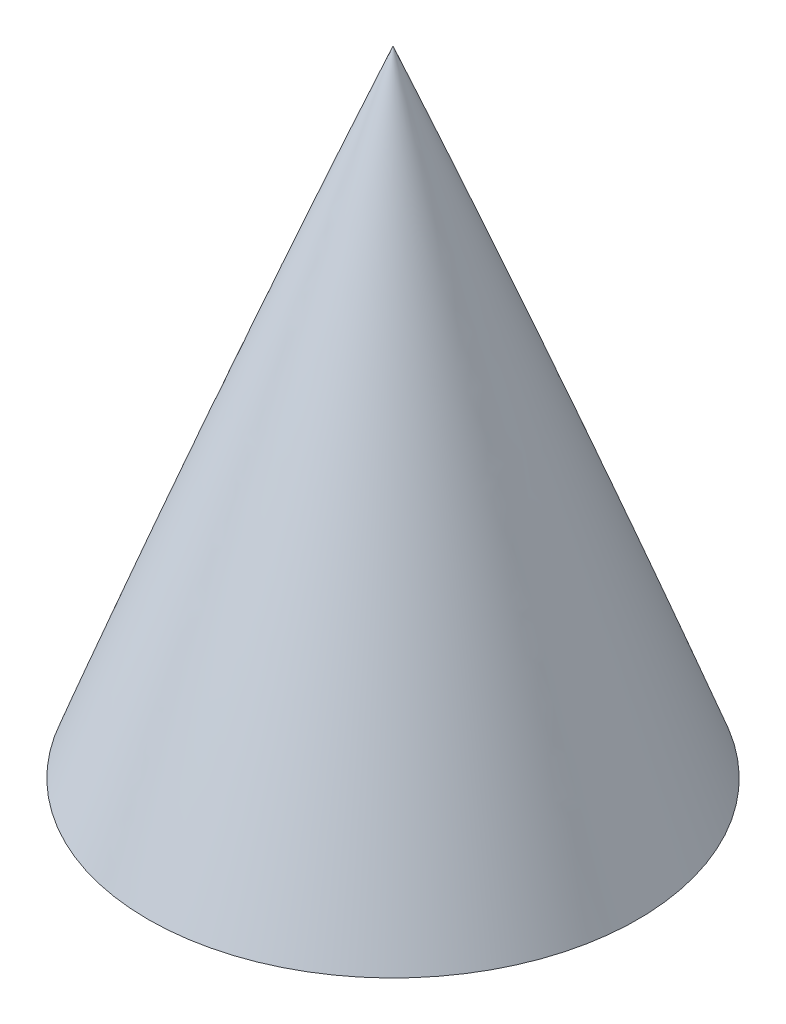
ISO-10303-21;
HEADER;
FILE_DESCRIPTION(('STEP AP214'),'2;1');
FILE_NAME('part.step','',(''),(''),'','','');
FILE_SCHEMA(('AUTOMOTIVE_DESIGN { 1 0 10303 214 1 1 1 1 }'));
ENDSEC;
DATA;
#1=APPLICATION_CONTEXT('core data for automotive mechanical design processes');
#2=APPLICATION_PROTOCOL_DEFINITION('international standard','automotive_design',2000,#1);
#3=PRODUCT_CONTEXT('',#1,'mechanical');
#4=PRODUCT('Part','Part','',(#3));
#5=PRODUCT_RELATED_PRODUCT_CATEGORY('part','',(#4));
#6=PRODUCT_DEFINITION_FORMATION('','',#4);
#7=PRODUCT_DEFINITION_CONTEXT('part definition',#1,'design');
#8=PRODUCT_DEFINITION('design','',#6,#7);
#9=PRODUCT_DEFINITION_SHAPE('','',#8);
#10=(LENGTH_UNIT() NAMED_UNIT(*) SI_UNIT(.MILLI.,.METRE.));
#11=(NAMED_UNIT(*) PLANE_ANGLE_UNIT() SI_UNIT($,.RADIAN.));
#12=(NAMED_UNIT(*) SI_UNIT($,.STERADIAN.) SOLID_ANGLE_UNIT());
#13=UNCERTAINTY_MEASURE_WITH_UNIT(LENGTH_MEASURE(1.E-05),#10,'distance_accuracy_value','');
#14=(GEOMETRIC_REPRESENTATION_CONTEXT(3) GLOBAL_UNCERTAINTY_ASSIGNED_CONTEXT((#13)) GLOBAL_UNIT_ASSIGNED_CONTEXT((#10,
#11,#12)) REPRESENTATION_CONTEXT('',''));
#15=CARTESIAN_POINT('',(0.,0.,0.));
#16=DIRECTION('',(0.,0.,1.));
#17=DIRECTION('',(1.,0.,0.));
#18=AXIS2_PLACEMENT_3D('',#15,#16,#17);
#19=CARTESIAN_POINT('',(0.,0.,-993.420310811265));
#20=DIRECTION('',(-1.,0.,0.));
#21=DIRECTION('',(0.,0.,1.));
#22=AXIS2_PLACEMENT_3D('',#19,#20,#21);
#23=CIRCLE('',#22,1069.62031081127);
#24=TRIMMED_CURVE('',#23,(PARAMETER_VALUE(-0.379743443275763)),
(PARAMETER_VALUE(0.379743443275763)),.T.,.PARAMETER.);
#25=CARTESIAN_POINT('',(0.,0.,0.));
#26=DIRECTION('',(0.,1.,0.));
#27=AXIS1_PLACEMENT('',#25,#26);
#28=SURFACE_OF_REVOLUTION('',#24,#27);
#29=CARTESIAN_POINT('',(-3.33066907387547E-13,396.489212170568,0.));
#30=VERTEX_POINT('',#29);
#31=VERTEX_LOOP('',#30);
#32=FACE_BOUND('',#31,.T.);
#33=CARTESIAN_POINT('',(0.,370.,0.));
#34=DIRECTION('',(0.,-1.,0.));
#35=DIRECTION('',(0.,0.,-1.));
#36=AXIS2_PLACEMENT_3D('',#33,#34,#35);
#37=CIRCLE('',#36,10.1670592268335);
#38=CARTESIAN_POINT('',(0.,370.,-10.1670592268335));
#39=VERTEX_POINT('',#38);
#40=EDGE_CURVE('E47',#39,#39,#37,.T.);
#41=ORIENTED_EDGE('',*,*,#40,.T.);
#42=EDGE_LOOP('',(#41));
#43=FACE_BOUND('',#42,.T.);
#44=ADVANCED_FACE('F43',(#32,#43),#28,.F.);
#45=CARTESIAN_POINT('',(0.,370.,0.));
#46=DIRECTION('',(0.,-1.,0.));
#47=DIRECTION('',(0.,0.,-1.));
#48=AXIS2_PLACEMENT_3D('',#45,#46,#47);
#49=PLANE('',#48);
#50=ORIENTED_EDGE('',*,*,#40,.F.);
#51=EDGE_LOOP('',(#50));
#52=FACE_BOUND('',#51,.T.);
#53=CARTESIAN_POINT('',(0.,370.,0.));
#54=DIRECTION('',(0.,-1.,0.));
#55=DIRECTION('',(0.,0.,-1.));
#56=AXIS2_PLACEMENT_3D('',#53,#54,#55);
#57=CIRCLE('',#56,12.2983827324279);
#58=CARTESIAN_POINT('',(0.,370.,-12.2983827324279));
#59=VERTEX_POINT('',#58);
#60=EDGE_CURVE('E12',#59,#59,#57,.T.);
#61=ORIENTED_EDGE('',*,*,#60,.T.);
#62=EDGE_LOOP('',(#61));
#63=FACE_BOUND('',#62,.T.);
#64=ADVANCED_FACE('F59',(#52,#63),#49,.T.);
#65=CARTESIAN_POINT('',(0.,0.,-993.420310811265));
#66=DIRECTION('',(-1.,0.,0.));
#67=DIRECTION('',(0.,0.,1.));
#68=AXIS2_PLACEMENT_3D('',#65,#66,#67);
#69=CIRCLE('',#68,1071.62031081127);
#70=TRIMMED_CURVE('',#69,(PARAMETER_VALUE(-0.384392556962875)),
(PARAMETER_VALUE(0.384392556962875)),.T.,.PARAMETER.);
#71=CARTESIAN_POINT('',(0.,0.,0.));
#72=DIRECTION('',(0.,1.,0.));
#73=AXIS1_PLACEMENT('',#71,#72);
#74=SURFACE_OF_REVOLUTION('',#70,#73);
#75=CARTESIAN_POINT('',(0.,401.853426775089,0.));
#76=VERTEX_POINT('',#75);
#77=VERTEX_LOOP('',#76);
#78=FACE_BOUND('',#77,.T.);
#79=ORIENTED_EDGE('',*,*,#60,.F.);
#80=EDGE_LOOP('',(#79));
#81=FACE_BOUND('',#80,.T.);
#82=ADVANCED_FACE('F45',(#78,#81),#74,.T.);
#83=CLOSED_SHELL('',(#44,#64,#82));
#84=MANIFOLD_SOLID_BREP('B2',#83);
#85=ADVANCED_BREP_SHAPE_REPRESENTATION('',(#18,#84),#14);
#86=SHAPE_DEFINITION_REPRESENTATION(#9,#85);
ENDSEC;
END-ISO-10303-21;
